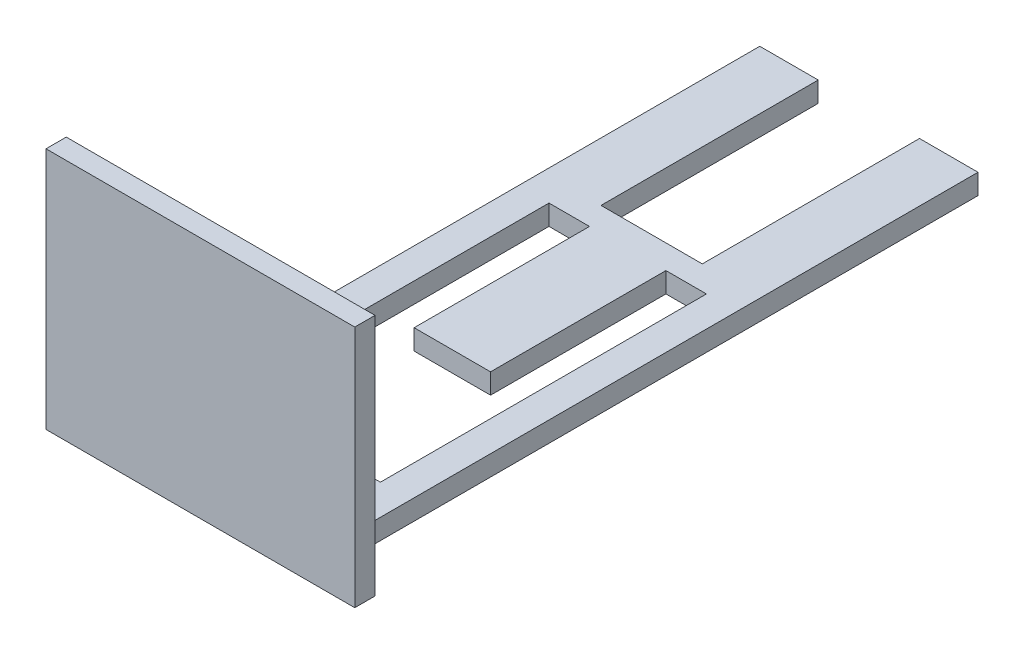
ISO-10303-21;
HEADER;
FILE_DESCRIPTION(('STEP AP214'),'2;1');
FILE_NAME('part.step','',(''),(''),'','','');
FILE_SCHEMA(('AUTOMOTIVE_DESIGN { 1 0 10303 214 1 1 1 1 }'));
ENDSEC;
DATA;
#1=APPLICATION_CONTEXT('core data for automotive mechanical design processes');
#2=APPLICATION_PROTOCOL_DEFINITION('international standard','automotive_design',2000,#1);
#3=PRODUCT_CONTEXT('',#1,'mechanical');
#4=PRODUCT('Part','Part','',(#3));
#5=PRODUCT_RELATED_PRODUCT_CATEGORY('part','',(#4));
#6=PRODUCT_DEFINITION_FORMATION('','',#4);
#7=PRODUCT_DEFINITION_CONTEXT('part definition',#1,'design');
#8=PRODUCT_DEFINITION('design','',#6,#7);
#9=PRODUCT_DEFINITION_SHAPE('','',#8);
#10=(LENGTH_UNIT() NAMED_UNIT(*) SI_UNIT(.MILLI.,.METRE.));
#11=(NAMED_UNIT(*) PLANE_ANGLE_UNIT() SI_UNIT($,.RADIAN.));
#12=(NAMED_UNIT(*) SI_UNIT($,.STERADIAN.) SOLID_ANGLE_UNIT());
#13=UNCERTAINTY_MEASURE_WITH_UNIT(LENGTH_MEASURE(1.E-05),#10,'distance_accuracy_value','');
#14=(GEOMETRIC_REPRESENTATION_CONTEXT(3) GLOBAL_UNCERTAINTY_ASSIGNED_CONTEXT((#13)) GLOBAL_UNIT_ASSIGNED_CONTEXT((#10,
#11,#12)) REPRESENTATION_CONTEXT('',''));
#15=CARTESIAN_POINT('',(0.,0.,0.));
#16=DIRECTION('',(0.,0.,1.));
#17=DIRECTION('',(1.,0.,0.));
#18=AXIS2_PLACEMENT_3D('',#15,#16,#17);
#19=CARTESIAN_POINT('',(10.1594816744328,0.,-18.5960395463432));
#20=DIRECTION('',(-1.,0.,0.));
#21=DIRECTION('',(0.,0.,1.));
#22=AXIS2_PLACEMENT_3D('',#19,#20,#21);
#23=PLANE('',#22);
#24=DIRECTION('',(0.,1.,0.));
#25=VECTOR('',#24,1.);
#26=CARTESIAN_POINT('',(10.1594816744327,11.,13.4039604536567));
#27=LINE('',#26,#25);
#28=CARTESIAN_POINT('',(10.1594816744327,-1.,13.4039604536567));
#29=VERTEX_POINT('',#28);
#30=CARTESIAN_POINT('',(10.1594816744327,0.,13.4039604536567));
#31=VERTEX_POINT('',#30);
#32=EDGE_CURVE('E217',#29,#31,#27,.T.);
#33=ORIENTED_EDGE('',*,*,#32,.F.);
#34=DIRECTION('',(0.,0.,-1.));
#35=VECTOR('',#34,1.);
#36=CARTESIAN_POINT('',(10.1594816744328,-1.,-18.5960395463432));
#37=LINE('',#36,#35);
#38=CARTESIAN_POINT('',(10.1594816744328,-1.,-18.5960395463432));
#39=VERTEX_POINT('',#38);
#40=EDGE_CURVE('E197',#29,#39,#37,.T.);
#41=ORIENTED_EDGE('',*,*,#40,.T.);
#42=DIRECTION('',(0.,-1.,0.));
#43=VECTOR('',#42,1.);
#44=CARTESIAN_POINT('',(10.1594816744328,0.,-18.5960395463432));
#45=LINE('',#44,#43);
#46=CARTESIAN_POINT('',(10.1594816744328,0.,-18.5960395463432));
#47=VERTEX_POINT('',#46);
#48=EDGE_CURVE('E383',#47,#39,#45,.T.);
#49=ORIENTED_EDGE('',*,*,#48,.F.);
#50=DIRECTION('',(0.,0.,-1.));
#51=VECTOR('',#50,1.);
#52=CARTESIAN_POINT('',(10.1594816744328,0.,-18.5960395463432));
#53=LINE('',#52,#51);
#54=EDGE_CURVE('E362',#31,#47,#53,.T.);
#55=ORIENTED_EDGE('',*,*,#54,.F.);
#56=EDGE_LOOP('',(#33,#41,#49,#55));
#57=FACE_BOUND('',#56,.T.);
#58=ADVANCED_FACE('F47',(#57),#23,.F.);
#59=CARTESIAN_POINT('',(-0.612945626888613,0.,14.4039604536567));
#60=DIRECTION('',(1.,0.,0.));
#61=DIRECTION('',(0.,0.,-1.));
#62=AXIS2_PLACEMENT_3D('',#59,#60,#61);
#63=PLANE('',#62);
#64=DIRECTION('',(0.,-1.,0.));
#65=VECTOR('',#64,1.);
#66=CARTESIAN_POINT('',(-0.612945626888612,11.,13.4039604536567));
#67=LINE('',#66,#65);
#68=CARTESIAN_POINT('',(-0.612945626888613,0.,13.4039604536567));
#69=VERTEX_POINT('',#68);
#70=CARTESIAN_POINT('',(-0.612945626888612,-1.,13.4039604536567));
#71=VERTEX_POINT('',#70);
#72=EDGE_CURVE('E11',#69,#71,#67,.T.);
#73=ORIENTED_EDGE('',*,*,#72,.F.);
#74=DIRECTION('',(0.,0.,1.));
#75=VECTOR('',#74,1.);
#76=CARTESIAN_POINT('',(-0.612945626888613,0.,14.4039604536567));
#77=LINE('',#76,#75);
#78=CARTESIAN_POINT('',(-0.61294562688856,0.,-18.5960395463433));
#79=VERTEX_POINT('',#78);
#80=EDGE_CURVE('E358',#79,#69,#77,.T.);
#81=ORIENTED_EDGE('',*,*,#80,.F.);
#82=DIRECTION('',(0.,-1.,0.));
#83=VECTOR('',#82,1.);
#84=CARTESIAN_POINT('',(-0.61294562688856,0.,-18.5960395463433));
#85=LINE('',#84,#83);
#86=CARTESIAN_POINT('',(-0.61294562688856,-1.,-18.5960395463433));
#87=VERTEX_POINT('',#86);
#88=EDGE_CURVE('E371',#79,#87,#85,.T.);
#89=ORIENTED_EDGE('',*,*,#88,.T.);
#90=DIRECTION('',(0.,0.,1.));
#91=VECTOR('',#90,1.);
#92=CARTESIAN_POINT('',(-0.612945626888613,-1.,14.4039604536567));
#93=LINE('',#92,#91);
#94=EDGE_CURVE('E198',#87,#71,#93,.T.);
#95=ORIENTED_EDGE('',*,*,#94,.T.);
#96=EDGE_LOOP('',(#73,#81,#89,#95));
#97=FACE_BOUND('',#96,.T.);
#98=ADVANCED_FACE('F418',(#97),#63,.F.);
#99=CARTESIAN_POINT('',(-0.61294562688856,0.,-18.5960395463433));
#100=DIRECTION('',(0.,0.,1.));
#101=DIRECTION('',(1.,0.,0.));
#102=AXIS2_PLACEMENT_3D('',#99,#100,#101);
#103=PLANE('',#102);
#104=DIRECTION('',(-1.,0.,0.));
#105=VECTOR('',#104,1.);
#106=CARTESIAN_POINT('',(-0.61294562688856,-1.,-18.5960395463433));
#107=LINE('',#106,#105);
#108=CARTESIAN_POINT('',(7.27205437311144,-1.,-18.5960395463433));
#109=VERTEX_POINT('',#108);
#110=EDGE_CURVE('E363',#39,#109,#107,.T.);
#111=ORIENTED_EDGE('',*,*,#110,.T.);
#112=DIRECTION('',(0.,1.,0.));
#113=VECTOR('',#112,1.);
#114=CARTESIAN_POINT('',(7.27205437311144,0.,-18.5960395463433));
#115=LINE('',#114,#113);
#116=CARTESIAN_POINT('',(7.27205437311144,0.,-18.5960395463433));
#117=VERTEX_POINT('',#116);
#118=EDGE_CURVE('E392',#109,#117,#115,.T.);
#119=ORIENTED_EDGE('',*,*,#118,.T.);
#120=DIRECTION('',(-1.,0.,0.));
#121=VECTOR('',#120,1.);
#122=CARTESIAN_POINT('',(-0.61294562688856,0.,-18.5960395463433));
#123=LINE('',#122,#121);
#124=EDGE_CURVE('E367',#47,#117,#123,.T.);
#125=ORIENTED_EDGE('',*,*,#124,.F.);
#126=ORIENTED_EDGE('',*,*,#48,.T.);
#127=EDGE_LOOP('',(#111,#119,#125,#126));
#128=FACE_BOUND('',#127,.T.);
#129=ADVANCED_FACE('F448',(#128),#103,.F.);
#130=CARTESIAN_POINT('',(0.,0.,0.));
#131=DIRECTION('',(0.,-1.,0.));
#132=DIRECTION('',(0.,0.,-1.));
#133=AXIS2_PLACEMENT_3D('',#130,#131,#132);
#134=PLANE('',#133);
#135=DIRECTION('',(0.,0.,-1.));
#136=VECTOR('',#135,1.);
#137=CARTESIAN_POINT('',(2.88705437311142,0.,2.96689616516232));
#138=LINE('',#137,#136);
#139=CARTESIAN_POINT('',(2.88705437311142,0.,1.96689616516232));
#140=VERTEX_POINT('',#139);
#141=CARTESIAN_POINT('',(2.88705437311143,0.,-6.69042346999049));
#142=VERTEX_POINT('',#141);
#143=EDGE_CURVE('E294',#140,#142,#138,.T.);
#144=ORIENTED_EDGE('',*,*,#143,.F.);
#145=DIRECTION('',(1.,0.,0.));
#146=VECTOR('',#145,1.);
#147=CARTESIAN_POINT('',(2.88705437311142,0.,1.96689616516232));
#148=LINE('',#147,#146);
#149=CARTESIAN_POINT('',(6.65948167443276,0.,1.96689616516232));
#150=VERTEX_POINT('',#149);
#151=EDGE_CURVE('E64',#140,#150,#148,.T.);
#152=ORIENTED_EDGE('',*,*,#151,.T.);
#153=DIRECTION('',(0.,0.,1.));
#154=VECTOR('',#153,1.);
#155=CARTESIAN_POINT('',(6.65948167443276,0.,-6.69042346999049));
#156=LINE('',#155,#154);
#157=CARTESIAN_POINT('',(6.65948167443276,0.,-6.69042346999049));
#158=VERTEX_POINT('',#157);
#159=EDGE_CURVE('E327',#158,#150,#156,.T.);
#160=ORIENTED_EDGE('',*,*,#159,.F.);
#161=DIRECTION('',(-1.,0.,0.));
#162=VECTOR('',#161,1.);
#163=CARTESIAN_POINT('',(8.65948167443275,0.,-6.69042346999049));
#164=LINE('',#163,#162);
#165=CARTESIAN_POINT('',(8.65948167443275,0.,-6.69042346999049));
#166=VERTEX_POINT('',#165);
#167=EDGE_CURVE('E323',#166,#158,#164,.T.);
#168=ORIENTED_EDGE('',*,*,#167,.F.);
#169=DIRECTION('',(0.,0.,-1.));
#170=VECTOR('',#169,1.);
#171=CARTESIAN_POINT('',(8.65948167443275,0.,9.40396045365673));
#172=LINE('',#171,#170);
#173=CARTESIAN_POINT('',(8.65948167443275,0.,9.40396045365673));
#174=VERTEX_POINT('',#173);
#175=EDGE_CURVE('E320',#174,#166,#172,.T.);
#176=ORIENTED_EDGE('',*,*,#175,.F.);
#177=DIRECTION('',(1.,0.,0.));
#178=VECTOR('',#177,1.);
#179=CARTESIAN_POINT('',(0.887054373111392,0.,9.40396045365672));
#180=LINE('',#179,#178);
#181=CARTESIAN_POINT('',(0.887054373111392,0.,9.40396045365672));
#182=VERTEX_POINT('',#181);
#183=EDGE_CURVE('E316',#182,#174,#180,.T.);
#184=ORIENTED_EDGE('',*,*,#183,.F.);
#185=DIRECTION('',(0.,0.,1.));
#186=VECTOR('',#185,1.);
#187=CARTESIAN_POINT('',(0.887054373111403,0.,2.96689616516233));
#188=LINE('',#187,#186);
#189=CARTESIAN_POINT('',(0.887054373111415,0.,-6.69042346999049));
#190=VERTEX_POINT('',#189);
#191=EDGE_CURVE('E313',#190,#182,#188,.T.);
#192=ORIENTED_EDGE('',*,*,#191,.F.);
#193=DIRECTION('',(-1.,0.,0.));
#194=VECTOR('',#193,1.);
#195=CARTESIAN_POINT('',(2.88705437311143,0.,-6.69042346999049));
#196=LINE('',#195,#194);
#197=EDGE_CURVE('E301',#142,#190,#196,.T.);
#198=ORIENTED_EDGE('',*,*,#197,.F.);
#199=EDGE_LOOP('',(#144,#152,#160,#168,#176,#184,#192,#198));
#200=FACE_BOUND('',#199,.T.);
#201=ORIENTED_EDGE('',*,*,#124,.T.);
#202=DIRECTION('',(0.,0.,-1.));
#203=VECTOR('',#202,1.);
#204=CARTESIAN_POINT('',(7.27205437311144,0.,-7.87384063005447));
#205=LINE('',#204,#203);
#206=CARTESIAN_POINT('',(7.27205437311144,0.,-7.87384063005447));
#207=VERTEX_POINT('',#206);
#208=EDGE_CURVE('E257',#207,#117,#205,.T.);
#209=ORIENTED_EDGE('',*,*,#208,.F.);
#210=DIRECTION('',(1.,0.,0.));
#211=VECTOR('',#210,1.);
#212=CARTESIAN_POINT('',(2.27205437311144,0.,-7.87384063005447));
#213=LINE('',#212,#211);
#214=CARTESIAN_POINT('',(2.27205437311144,0.,-7.87384063005447));
#215=VERTEX_POINT('',#214);
#216=EDGE_CURVE('E264',#215,#207,#213,.T.);
#217=ORIENTED_EDGE('',*,*,#216,.F.);
#218=DIRECTION('',(0.,0.,1.));
#219=VECTOR('',#218,1.);
#220=CARTESIAN_POINT('',(2.27205437311144,0.,-18.5960395463433));
#221=LINE('',#220,#219);
#222=CARTESIAN_POINT('',(2.27205437311144,0.,-18.5960395463433));
#223=VERTEX_POINT('',#222);
#224=EDGE_CURVE('E260',#223,#215,#221,.T.);
#225=ORIENTED_EDGE('',*,*,#224,.F.);
#226=EDGE_CURVE('E366',#223,#79,#123,.T.);
#227=ORIENTED_EDGE('',*,*,#226,.T.);
#228=ORIENTED_EDGE('',*,*,#80,.T.);
#229=DIRECTION('',(-1.,0.,0.));
#230=VECTOR('',#229,1.);
#231=CARTESIAN_POINT('',(-0.612945626888613,0.,13.4039604536567));
#232=LINE('',#231,#230);
#233=EDGE_CURVE('E279',#31,#69,#232,.T.);
#234=ORIENTED_EDGE('',*,*,#233,.F.);
#235=ORIENTED_EDGE('',*,*,#54,.T.);
#236=EDGE_LOOP('',(#201,#209,#217,#225,#227,#228,#234,#235));
#237=FACE_BOUND('',#236,.T.);
#238=ADVANCED_FACE('F413',(#200,#237),#134,.F.);
#239=CARTESIAN_POINT('',(0.,-1.,0.));
#240=DIRECTION('',(0.,-1.,0.));
#241=DIRECTION('',(0.,0.,-1.));
#242=AXIS2_PLACEMENT_3D('',#239,#240,#241);
#243=PLANE('',#242);
#244=DIRECTION('',(1.,0.,0.));
#245=VECTOR('',#244,1.);
#246=CARTESIAN_POINT('',(0.,-1.,1.96689616516232));
#247=LINE('',#246,#245);
#248=CARTESIAN_POINT('',(2.88705437311142,-1.,1.96689616516232));
#249=VERTEX_POINT('',#248);
#250=CARTESIAN_POINT('',(6.65948167443276,-1.,1.96689616516232));
#251=VERTEX_POINT('',#250);
#252=EDGE_CURVE('E254',#249,#251,#247,.T.);
#253=ORIENTED_EDGE('',*,*,#252,.F.);
#254=DIRECTION('',(0.,0.,1.));
#255=VECTOR('',#254,1.);
#256=CARTESIAN_POINT('',(2.88705437311143,-1.,-6.69042346999049));
#257=LINE('',#256,#255);
#258=CARTESIAN_POINT('',(2.88705437311143,-1.,-6.69042346999049));
#259=VERTEX_POINT('',#258);
#260=EDGE_CURVE('E290',#259,#249,#257,.T.);
#261=ORIENTED_EDGE('',*,*,#260,.F.);
#262=DIRECTION('',(-1.,0.,0.));
#263=VECTOR('',#262,1.);
#264=CARTESIAN_POINT('',(2.88705437311143,-1.,-6.69042346999049));
#265=LINE('',#264,#263);
#266=CARTESIAN_POINT('',(0.887054373111415,-1.,-6.69042346999049));
#267=VERTEX_POINT('',#266);
#268=EDGE_CURVE('E305',#259,#267,#265,.T.);
#269=ORIENTED_EDGE('',*,*,#268,.T.);
#270=DIRECTION('',(0.,0.,1.));
#271=VECTOR('',#270,1.);
#272=CARTESIAN_POINT('',(0.887054373111413,-1.,2.25094822235405));
#273=LINE('',#272,#271);
#274=CARTESIAN_POINT('',(0.887054373111392,-1.,9.40396045365672));
#275=VERTEX_POINT('',#274);
#276=EDGE_CURVE('E387',#267,#275,#273,.T.);
#277=ORIENTED_EDGE('',*,*,#276,.T.);
#278=DIRECTION('',(1.,0.,0.));
#279=VECTOR('',#278,1.);
#280=CARTESIAN_POINT('',(0.887054373111392,-1.,9.40396045365672));
#281=LINE('',#280,#279);
#282=CARTESIAN_POINT('',(8.65948167443275,-1.,9.40396045365673));
#283=VERTEX_POINT('',#282);
#284=EDGE_CURVE('E309',#275,#283,#281,.T.);
#285=ORIENTED_EDGE('',*,*,#284,.T.);
#286=DIRECTION('',(0.,0.,-1.));
#287=VECTOR('',#286,1.);
#288=CARTESIAN_POINT('',(8.65948167443275,-1.,9.40396045365673));
#289=LINE('',#288,#287);
#290=CARTESIAN_POINT('',(8.65948167443275,-1.,-6.69042346999049));
#291=VERTEX_POINT('',#290);
#292=EDGE_CURVE('E335',#283,#291,#289,.T.);
#293=ORIENTED_EDGE('',*,*,#292,.T.);
#294=DIRECTION('',(-1.,0.,0.));
#295=VECTOR('',#294,1.);
#296=CARTESIAN_POINT('',(8.65948167443275,-1.,-6.69042346999049));
#297=LINE('',#296,#295);
#298=CARTESIAN_POINT('',(6.65948167443276,-1.,-6.69042346999049));
#299=VERTEX_POINT('',#298);
#300=EDGE_CURVE('E339',#291,#299,#297,.T.);
#301=ORIENTED_EDGE('',*,*,#300,.T.);
#302=DIRECTION('',(0.,0.,1.));
#303=VECTOR('',#302,1.);
#304=CARTESIAN_POINT('',(6.65948167443276,-1.,-6.69042346999049));
#305=LINE('',#304,#303);
#306=EDGE_CURVE('E317',#299,#251,#305,.T.);
#307=ORIENTED_EDGE('',*,*,#306,.T.);
#308=EDGE_LOOP('',(#253,#261,#269,#277,#285,#293,#301,#307));
#309=FACE_BOUND('',#308,.T.);
#310=DIRECTION('',(0.,0.,1.));
#311=VECTOR('',#310,1.);
#312=CARTESIAN_POINT('',(7.27205437311144,-1.,0.));
#313=LINE('',#312,#311);
#314=CARTESIAN_POINT('',(7.27205437311144,-1.,-7.87384063005447));
#315=VERTEX_POINT('',#314);
#316=EDGE_CURVE('E276',#109,#315,#313,.T.);
#317=ORIENTED_EDGE('',*,*,#316,.F.);
#318=ORIENTED_EDGE('',*,*,#110,.F.);
#319=ORIENTED_EDGE('',*,*,#40,.F.);
#320=DIRECTION('',(-1.,0.,0.));
#321=VECTOR('',#320,1.);
#322=CARTESIAN_POINT('',(12.3944816744327,-1.,13.4039604536567));
#323=LINE('',#322,#321);
#324=CARTESIAN_POINT('',(12.3944816744327,-1.,13.4039604536567));
#325=VERTEX_POINT('',#324);
#326=EDGE_CURVE('E205',#325,#29,#323,.T.);
#327=ORIENTED_EDGE('',*,*,#326,.F.);
#328=DIRECTION('',(0.,0.,-1.));
#329=VECTOR('',#328,1.);
#330=CARTESIAN_POINT('',(12.3944816744327,-1.,14.4039604536567));
#331=LINE('',#330,#329);
#332=CARTESIAN_POINT('',(12.3944816744327,-1.,14.4039604536567));
#333=VERTEX_POINT('',#332);
#334=EDGE_CURVE('E201',#333,#325,#331,.T.);
#335=ORIENTED_EDGE('',*,*,#334,.F.);
#336=DIRECTION('',(1.,0.,0.));
#337=VECTOR('',#336,1.);
#338=CARTESIAN_POINT('',(10.1594816744327,-1.,14.4039604536567));
#339=LINE('',#338,#337);
#340=CARTESIAN_POINT('',(-2.84794562688861,-1.,14.4039604536567));
#341=VERTEX_POINT('',#340);
#342=EDGE_CURVE('E187',#341,#333,#339,.T.);
#343=ORIENTED_EDGE('',*,*,#342,.F.);
#344=DIRECTION('',(0.,0.,1.));
#345=VECTOR('',#344,1.);
#346=CARTESIAN_POINT('',(-2.84794562688861,-1.,13.4039604536567));
#347=LINE('',#346,#345);
#348=CARTESIAN_POINT('',(-2.84794562688861,-1.,13.4039604536567));
#349=VERTEX_POINT('',#348);
#350=EDGE_CURVE('E232',#349,#341,#347,.T.);
#351=ORIENTED_EDGE('',*,*,#350,.F.);
#352=DIRECTION('',(1.,0.,0.));
#353=VECTOR('',#352,1.);
#354=CARTESIAN_POINT('',(-2.84794562688861,-1.,13.4039604536567));
#355=LINE('',#354,#353);
#356=EDGE_CURVE('E240',#349,#71,#355,.T.);
#357=ORIENTED_EDGE('',*,*,#356,.T.);
#358=ORIENTED_EDGE('',*,*,#94,.F.);
#359=CARTESIAN_POINT('',(2.27205437311144,-1.,-18.5960395463433));
#360=VERTEX_POINT('',#359);
#361=EDGE_CURVE('E376',#360,#87,#107,.T.);
#362=ORIENTED_EDGE('',*,*,#361,.F.);
#363=DIRECTION('',(0.,0.,-1.));
#364=VECTOR('',#363,1.);
#365=CARTESIAN_POINT('',(2.27205437311144,-1.,0.));
#366=LINE('',#365,#364);
#367=CARTESIAN_POINT('',(2.27205437311144,-1.,-7.87384063005447));
#368=VERTEX_POINT('',#367);
#369=EDGE_CURVE('E72',#368,#360,#366,.T.);
#370=ORIENTED_EDGE('',*,*,#369,.F.);
#371=DIRECTION('',(-1.,0.,0.));
#372=VECTOR('',#371,1.);
#373=CARTESIAN_POINT('',(0.,-1.,-7.87384063005447));
#374=LINE('',#373,#372);
#375=EDGE_CURVE('E51',#315,#368,#374,.T.);
#376=ORIENTED_EDGE('',*,*,#375,.F.);
#377=EDGE_LOOP('',(#317,#318,#319,#327,#335,#343,#351,#357,#358,#362,#370,#376));
#378=FACE_BOUND('',#377,.T.);
#379=ADVANCED_FACE('F203',(#309,#378),#243,.T.);
#380=CARTESIAN_POINT('',(6.65948167443276,0.,0.));
#381=DIRECTION('',(1.,0.,0.));
#382=DIRECTION('',(0.,0.,-1.));
#383=AXIS2_PLACEMENT_3D('',#380,#381,#382);
#384=PLANE('',#383);
#385=DIRECTION('',(0.,-1.,0.));
#386=VECTOR('',#385,1.);
#387=CARTESIAN_POINT('',(6.65948167443276,0.,1.96689616516232));
#388=LINE('',#387,#386);
#389=EDGE_CURVE('E250',#150,#251,#388,.T.);
#390=ORIENTED_EDGE('',*,*,#389,.T.);
#391=ORIENTED_EDGE('',*,*,#306,.F.);
#392=DIRECTION('',(0.,-1.,0.));
#393=VECTOR('',#392,1.);
#394=CARTESIAN_POINT('',(6.65948167443276,0.,-6.69042346999049));
#395=LINE('',#394,#393);
#396=EDGE_CURVE('E331',#158,#299,#395,.T.);
#397=ORIENTED_EDGE('',*,*,#396,.F.);
#398=ORIENTED_EDGE('',*,*,#159,.T.);
#399=EDGE_LOOP('',(#390,#391,#397,#398));
#400=FACE_BOUND('',#399,.T.);
#401=ADVANCED_FACE('F49',(#400),#384,.T.);
#402=CARTESIAN_POINT('',(10.1594816744327,0.,14.4039604536567));
#403=DIRECTION('',(0.,0.,-1.));
#404=DIRECTION('',(-1.,0.,0.));
#405=AXIS2_PLACEMENT_3D('',#402,#403,#404);
#406=PLANE('',#405);
#407=ORIENTED_EDGE('',*,*,#342,.T.);
#408=DIRECTION('',(0.,-1.,0.));
#409=VECTOR('',#408,1.);
#410=CARTESIAN_POINT('',(12.3944816744327,11.,14.4039604536567));
#411=LINE('',#410,#409);
#412=CARTESIAN_POINT('',(12.3944816744327,11.,14.4039604536567));
#413=VERTEX_POINT('',#412);
#414=EDGE_CURVE('E191',#413,#333,#411,.T.);
#415=ORIENTED_EDGE('',*,*,#414,.F.);
#416=DIRECTION('',(1.,0.,0.));
#417=VECTOR('',#416,1.);
#418=CARTESIAN_POINT('',(10.1594816744327,11.,14.4039604536567));
#419=LINE('',#418,#417);
#420=CARTESIAN_POINT('',(-2.84794562688861,11.,14.4039604536567));
#421=VERTEX_POINT('',#420);
#422=EDGE_CURVE('E280',#421,#413,#419,.T.);
#423=ORIENTED_EDGE('',*,*,#422,.F.);
#424=DIRECTION('',(0.,1.,0.));
#425=VECTOR('',#424,1.);
#426=CARTESIAN_POINT('',(-2.84794562688861,11.,14.4039604536567));
#427=LINE('',#426,#425);
#428=EDGE_CURVE('E193',#341,#421,#427,.T.);
#429=ORIENTED_EDGE('',*,*,#428,.F.);
#430=EDGE_LOOP('',(#407,#415,#423,#429));
#431=FACE_BOUND('',#430,.T.);
#432=ADVANCED_FACE('F189',(#431),#406,.F.);
#433=ORIENTED_EDGE('',*,*,#226,.F.);
#434=DIRECTION('',(0.,-1.,0.));
#435=VECTOR('',#434,1.);
#436=CARTESIAN_POINT('',(2.27205437311144,0.,-18.5960395463433));
#437=LINE('',#436,#435);
#438=EDGE_CURVE('E390',#223,#360,#437,.T.);
#439=ORIENTED_EDGE('',*,*,#438,.T.);
#440=ORIENTED_EDGE('',*,*,#361,.T.);
#441=ORIENTED_EDGE('',*,*,#88,.F.);
#442=EDGE_LOOP('',(#433,#439,#440,#441));
#443=FACE_BOUND('',#442,.T.);
#444=ADVANCED_FACE('F416',(#443),#103,.F.);
#445=CARTESIAN_POINT('',(0.887054373111403,0.,2.96689616516233));
#446=DIRECTION('',(1.,0.,0.));
#447=DIRECTION('',(0.,0.,-1.));
#448=AXIS2_PLACEMENT_3D('',#445,#446,#447);
#449=PLANE('',#448);
#450=DIRECTION('',(0.,-1.,0.));
#451=VECTOR('',#450,1.);
#452=CARTESIAN_POINT('',(0.887054373111392,0.,9.40396045365672));
#453=LINE('',#452,#451);
#454=EDGE_CURVE('E354',#182,#275,#453,.T.);
#455=ORIENTED_EDGE('',*,*,#454,.T.);
#456=ORIENTED_EDGE('',*,*,#276,.F.);
#457=DIRECTION('',(0.,-1.,0.));
#458=VECTOR('',#457,1.);
#459=CARTESIAN_POINT('',(0.887054373111415,0.,-6.69042346999049));
#460=LINE('',#459,#458);
#461=EDGE_CURVE('E286',#190,#267,#460,.T.);
#462=ORIENTED_EDGE('',*,*,#461,.F.);
#463=ORIENTED_EDGE('',*,*,#191,.T.);
#464=EDGE_LOOP('',(#455,#456,#462,#463));
#465=FACE_BOUND('',#464,.T.);
#466=ADVANCED_FACE('F458',(#465),#449,.T.);
#467=CARTESIAN_POINT('',(0.887054373111392,0.,9.40396045365672));
#468=DIRECTION('',(0.,0.,-1.));
#469=DIRECTION('',(-1.,0.,0.));
#470=AXIS2_PLACEMENT_3D('',#467,#468,#469);
#471=PLANE('',#470);
#472=ORIENTED_EDGE('',*,*,#284,.F.);
#473=ORIENTED_EDGE('',*,*,#454,.F.);
#474=ORIENTED_EDGE('',*,*,#183,.T.);
#475=DIRECTION('',(0.,-1.,0.));
#476=VECTOR('',#475,1.);
#477=CARTESIAN_POINT('',(8.65948167443275,0.,9.40396045365673));
#478=LINE('',#477,#476);
#479=EDGE_CURVE('E351',#174,#283,#478,.T.);
#480=ORIENTED_EDGE('',*,*,#479,.T.);
#481=EDGE_LOOP('',(#472,#473,#474,#480));
#482=FACE_BOUND('',#481,.T.);
#483=ADVANCED_FACE('F490',(#482),#471,.T.);
#484=CARTESIAN_POINT('',(8.65948167443275,0.,9.40396045365673));
#485=DIRECTION('',(-1.,0.,0.));
#486=DIRECTION('',(0.,0.,1.));
#487=AXIS2_PLACEMENT_3D('',#484,#485,#486);
#488=PLANE('',#487);
#489=ORIENTED_EDGE('',*,*,#292,.F.);
#490=ORIENTED_EDGE('',*,*,#479,.F.);
#491=ORIENTED_EDGE('',*,*,#175,.T.);
#492=DIRECTION('',(0.,-1.,0.));
#493=VECTOR('',#492,1.);
#494=CARTESIAN_POINT('',(8.65948167443275,0.,-6.69042346999049));
#495=LINE('',#494,#493);
#496=EDGE_CURVE('E348',#166,#291,#495,.T.);
#497=ORIENTED_EDGE('',*,*,#496,.T.);
#498=EDGE_LOOP('',(#489,#490,#491,#497));
#499=FACE_BOUND('',#498,.T.);
#500=ADVANCED_FACE('F493',(#499),#488,.T.);
#501=CARTESIAN_POINT('',(8.65948167443275,0.,-6.69042346999049));
#502=DIRECTION('',(0.,0.,1.));
#503=DIRECTION('',(1.,0.,0.));
#504=AXIS2_PLACEMENT_3D('',#501,#502,#503);
#505=PLANE('',#504);
#506=ORIENTED_EDGE('',*,*,#300,.F.);
#507=ORIENTED_EDGE('',*,*,#496,.F.);
#508=ORIENTED_EDGE('',*,*,#167,.T.);
#509=ORIENTED_EDGE('',*,*,#396,.T.);
#510=EDGE_LOOP('',(#506,#507,#508,#509));
#511=FACE_BOUND('',#510,.T.);
#512=ADVANCED_FACE('F474',(#511),#505,.T.);
#513=CARTESIAN_POINT('',(2.88705437311143,0.,-6.69042346999049));
#514=DIRECTION('',(0.,0.,-1.));
#515=DIRECTION('',(-1.,0.,0.));
#516=AXIS2_PLACEMENT_3D('',#513,#514,#515);
#517=PLANE('',#516);
#518=ORIENTED_EDGE('',*,*,#461,.T.);
#519=ORIENTED_EDGE('',*,*,#268,.F.);
#520=DIRECTION('',(0.,-1.,0.));
#521=VECTOR('',#520,1.);
#522=CARTESIAN_POINT('',(2.88705437311143,0.,-6.69042346999049));
#523=LINE('',#522,#521);
#524=EDGE_CURVE('E297',#142,#259,#523,.T.);
#525=ORIENTED_EDGE('',*,*,#524,.F.);
#526=ORIENTED_EDGE('',*,*,#197,.T.);
#527=EDGE_LOOP('',(#518,#519,#525,#526));
#528=FACE_BOUND('',#527,.T.);
#529=ADVANCED_FACE('F483',(#528),#517,.F.);
#530=CARTESIAN_POINT('',(2.88705437311142,0.,0.));
#531=DIRECTION('',(-1.,0.,0.));
#532=DIRECTION('',(0.,0.,1.));
#533=AXIS2_PLACEMENT_3D('',#530,#531,#532);
#534=PLANE('',#533);
#535=DIRECTION('',(0.,1.,0.));
#536=VECTOR('',#535,1.);
#537=CARTESIAN_POINT('',(2.88705437311142,-2.34856735914946,1.96689616516232));
#538=LINE('',#537,#536);
#539=EDGE_CURVE('E245',#249,#140,#538,.T.);
#540=ORIENTED_EDGE('',*,*,#539,.T.);
#541=ORIENTED_EDGE('',*,*,#143,.T.);
#542=ORIENTED_EDGE('',*,*,#524,.T.);
#543=ORIENTED_EDGE('',*,*,#260,.T.);
#544=EDGE_LOOP('',(#540,#541,#542,#543));
#545=FACE_BOUND('',#544,.T.);
#546=ADVANCED_FACE('F438',(#545),#534,.T.);
#547=CARTESIAN_POINT('',(-0.612945626888613,11.,13.4039604536567));
#548=DIRECTION('',(0.,0.,1.));
#549=DIRECTION('',(1.,0.,0.));
#550=AXIS2_PLACEMENT_3D('',#547,#548,#549);
#551=PLANE('',#550);
#552=ORIENTED_EDGE('',*,*,#233,.T.);
#553=ORIENTED_EDGE('',*,*,#72,.T.);
#554=ORIENTED_EDGE('',*,*,#356,.F.);
#555=DIRECTION('',(0.,-1.,0.));
#556=VECTOR('',#555,1.);
#557=CARTESIAN_POINT('',(-2.84794562688861,11.,13.4039604536567));
#558=LINE('',#557,#556);
#559=CARTESIAN_POINT('',(-2.84794562688861,11.,13.4039604536567));
#560=VERTEX_POINT('',#559);
#561=EDGE_CURVE('E228',#560,#349,#558,.T.);
#562=ORIENTED_EDGE('',*,*,#561,.F.);
#563=DIRECTION('',(-1.,0.,0.));
#564=VECTOR('',#563,1.);
#565=CARTESIAN_POINT('',(-0.612945626888613,11.,13.4039604536567));
#566=LINE('',#565,#564);
#567=CARTESIAN_POINT('',(12.3944816744327,11.,13.4039604536567));
#568=VERTEX_POINT('',#567);
#569=EDGE_CURVE('E283',#568,#560,#566,.T.);
#570=ORIENTED_EDGE('',*,*,#569,.F.);
#571=DIRECTION('',(0.,1.,0.));
#572=VECTOR('',#571,1.);
#573=CARTESIAN_POINT('',(12.3944816744327,11.,13.4039604536567));
#574=LINE('',#573,#572);
#575=EDGE_CURVE('E210',#325,#568,#574,.T.);
#576=ORIENTED_EDGE('',*,*,#575,.F.);
#577=ORIENTED_EDGE('',*,*,#326,.T.);
#578=ORIENTED_EDGE('',*,*,#32,.T.);
#579=EDGE_LOOP('',(#552,#553,#554,#562,#570,#576,#577,#578));
#580=FACE_BOUND('',#579,.T.);
#581=ADVANCED_FACE('F421',(#580),#551,.F.);
#582=CARTESIAN_POINT('',(0.,11.,0.));
#583=DIRECTION('',(0.,-1.,0.));
#584=DIRECTION('',(0.,0.,-1.));
#585=AXIS2_PLACEMENT_3D('',#582,#583,#584);
#586=PLANE('',#585);
#587=ORIENTED_EDGE('',*,*,#569,.T.);
#588=DIRECTION('',(0.,0.,-1.));
#589=VECTOR('',#588,1.);
#590=CARTESIAN_POINT('',(-2.84794562688861,11.,13.4039604536567));
#591=LINE('',#590,#589);
#592=EDGE_CURVE('E237',#421,#560,#591,.T.);
#593=ORIENTED_EDGE('',*,*,#592,.F.);
#594=ORIENTED_EDGE('',*,*,#422,.T.);
#595=DIRECTION('',(0.,0.,1.));
#596=VECTOR('',#595,1.);
#597=CARTESIAN_POINT('',(12.3944816744327,11.,14.4039604536567));
#598=LINE('',#597,#596);
#599=EDGE_CURVE('E215',#568,#413,#598,.T.);
#600=ORIENTED_EDGE('',*,*,#599,.F.);
#601=EDGE_LOOP('',(#587,#593,#594,#600));
#602=FACE_BOUND('',#601,.T.);
#603=ADVANCED_FACE('F427',(#602),#586,.F.);
#604=CARTESIAN_POINT('',(7.27205437311144,-2.34856735914946,-7.87384063005447));
#605=DIRECTION('',(1.,0.,0.));
#606=DIRECTION('',(0.,0.,-1.));
#607=AXIS2_PLACEMENT_3D('',#604,#605,#606);
#608=PLANE('',#607);
#609=ORIENTED_EDGE('',*,*,#316,.T.);
#610=DIRECTION('',(0.,1.,0.));
#611=VECTOR('',#610,1.);
#612=CARTESIAN_POINT('',(7.27205437311144,-2.34856735914946,-7.87384063005447));
#613=LINE('',#612,#611);
#614=EDGE_CURVE('E269',#315,#207,#613,.T.);
#615=ORIENTED_EDGE('',*,*,#614,.T.);
#616=ORIENTED_EDGE('',*,*,#208,.T.);
#617=ORIENTED_EDGE('',*,*,#118,.F.);
#618=EDGE_LOOP('',(#609,#615,#616,#617));
#619=FACE_BOUND('',#618,.T.);
#620=ADVANCED_FACE('F429',(#619),#608,.F.);
#621=CARTESIAN_POINT('',(2.27205437311144,-2.34856735914946,-7.87384063005447));
#622=DIRECTION('',(0.,0.,1.));
#623=DIRECTION('',(1.,0.,0.));
#624=AXIS2_PLACEMENT_3D('',#621,#622,#623);
#625=PLANE('',#624);
#626=ORIENTED_EDGE('',*,*,#375,.T.);
#627=DIRECTION('',(0.,1.,0.));
#628=VECTOR('',#627,1.);
#629=CARTESIAN_POINT('',(2.27205437311144,-2.34856735914946,-7.87384063005447));
#630=LINE('',#629,#628);
#631=EDGE_CURVE('E268',#368,#215,#630,.T.);
#632=ORIENTED_EDGE('',*,*,#631,.T.);
#633=ORIENTED_EDGE('',*,*,#216,.T.);
#634=ORIENTED_EDGE('',*,*,#614,.F.);
#635=EDGE_LOOP('',(#626,#632,#633,#634));
#636=FACE_BOUND('',#635,.T.);
#637=ADVANCED_FACE('F401',(#636),#625,.F.);
#638=CARTESIAN_POINT('',(2.27205437311144,-2.34856735914946,-18.5960395463433));
#639=DIRECTION('',(-1.,0.,0.));
#640=DIRECTION('',(0.,0.,1.));
#641=AXIS2_PLACEMENT_3D('',#638,#639,#640);
#642=PLANE('',#641);
#643=ORIENTED_EDGE('',*,*,#369,.T.);
#644=ORIENTED_EDGE('',*,*,#438,.F.);
#645=ORIENTED_EDGE('',*,*,#224,.T.);
#646=ORIENTED_EDGE('',*,*,#631,.F.);
#647=EDGE_LOOP('',(#643,#644,#645,#646));
#648=FACE_BOUND('',#647,.T.);
#649=ADVANCED_FACE('F402',(#648),#642,.F.);
#650=CARTESIAN_POINT('',(0.,0.,1.96689616516232));
#651=DIRECTION('',(0.,0.,-1.));
#652=DIRECTION('',(-1.,0.,0.));
#653=AXIS2_PLACEMENT_3D('',#650,#651,#652);
#654=PLANE('',#653);
#655=ORIENTED_EDGE('',*,*,#252,.T.);
#656=ORIENTED_EDGE('',*,*,#389,.F.);
#657=ORIENTED_EDGE('',*,*,#151,.F.);
#658=ORIENTED_EDGE('',*,*,#539,.F.);
#659=EDGE_LOOP('',(#655,#656,#657,#658));
#660=FACE_BOUND('',#659,.T.);
#661=ADVANCED_FACE('F542',(#660),#654,.F.);
#662=CARTESIAN_POINT('',(-2.84794562688859,0.,0.));
#663=DIRECTION('',(-1.,0.,0.));
#664=DIRECTION('',(0.,0.,1.));
#665=AXIS2_PLACEMENT_3D('',#662,#663,#664);
#666=PLANE('',#665);
#667=ORIENTED_EDGE('',*,*,#561,.T.);
#668=ORIENTED_EDGE('',*,*,#350,.T.);
#669=ORIENTED_EDGE('',*,*,#428,.T.);
#670=ORIENTED_EDGE('',*,*,#592,.T.);
#671=EDGE_LOOP('',(#667,#668,#669,#670));
#672=FACE_BOUND('',#671,.T.);
#673=ADVANCED_FACE('F424',(#672),#666,.T.);
#674=CARTESIAN_POINT('',(12.3944816744328,0.,0.));
#675=DIRECTION('',(1.,0.,0.));
#676=DIRECTION('',(0.,0.,-1.));
#677=AXIS2_PLACEMENT_3D('',#674,#675,#676);
#678=PLANE('',#677);
#679=ORIENTED_EDGE('',*,*,#414,.T.);
#680=ORIENTED_EDGE('',*,*,#334,.T.);
#681=ORIENTED_EDGE('',*,*,#575,.T.);
#682=ORIENTED_EDGE('',*,*,#599,.T.);
#683=EDGE_LOOP('',(#679,#680,#681,#682));
#684=FACE_BOUND('',#683,.T.);
#685=ADVANCED_FACE('F213',(#684),#678,.T.);
#686=CLOSED_SHELL('',(#58,#98,#129,#238,#379,#401,#432,#444,#466,#483,#500,#512,#529,#546,#581,
#603,#620,#637,#649,#661,#673,#685));
#687=MANIFOLD_SOLID_BREP('B2',#686);
#688=ADVANCED_BREP_SHAPE_REPRESENTATION('',(#18,#687),#14);
#689=SHAPE_DEFINITION_REPRESENTATION(#9,#688);
ENDSEC;
END-ISO-10303-21;
